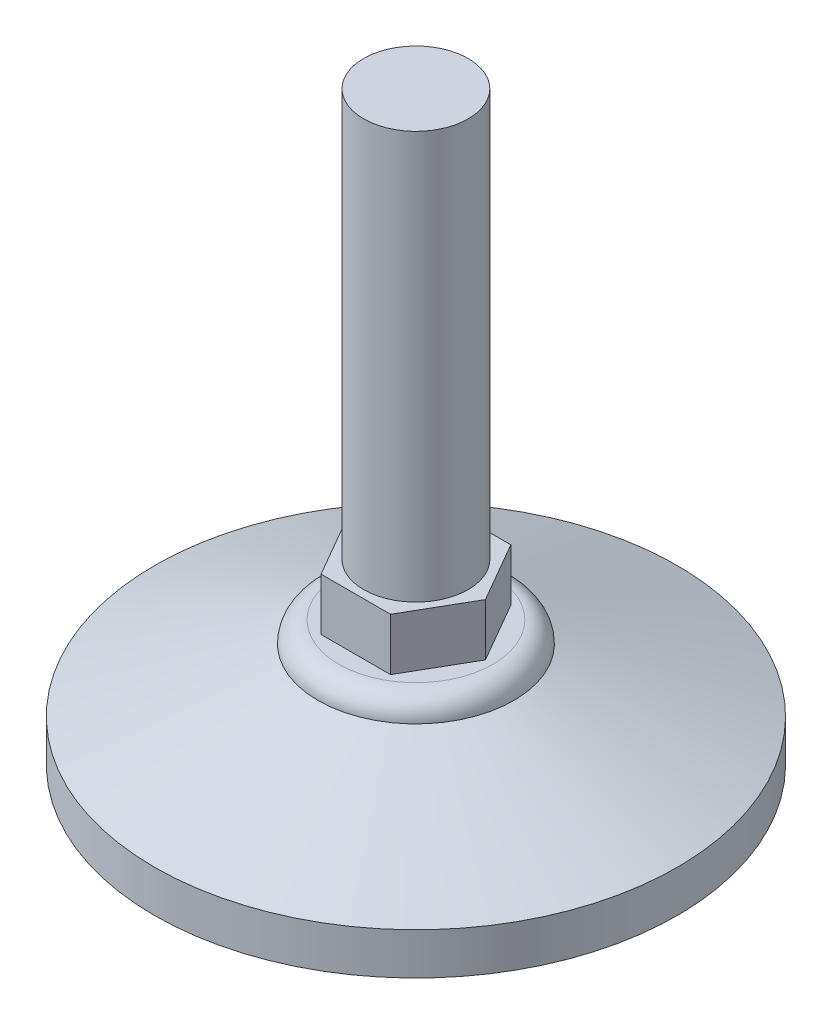
ISO-10303-21;
HEADER;
FILE_DESCRIPTION(('STEP AP214'),'2;1');
FILE_NAME('part.step','',(''),(''),'','','');
FILE_SCHEMA(('AUTOMOTIVE_DESIGN { 1 0 10303 214 1 1 1 1 }'));
ENDSEC;
DATA;
#1=APPLICATION_CONTEXT('core data for automotive mechanical design processes');
#2=APPLICATION_PROTOCOL_DEFINITION('international standard','automotive_design',2000,#1);
#3=PRODUCT_CONTEXT('',#1,'mechanical');
#4=PRODUCT('Part','Part','',(#3));
#5=PRODUCT_RELATED_PRODUCT_CATEGORY('part','',(#4));
#6=PRODUCT_DEFINITION_FORMATION('','',#4);
#7=PRODUCT_DEFINITION_CONTEXT('part definition',#1,'design');
#8=PRODUCT_DEFINITION('design','',#6,#7);
#9=PRODUCT_DEFINITION_SHAPE('','',#8);
#10=(LENGTH_UNIT() NAMED_UNIT(*) SI_UNIT(.MILLI.,.METRE.));
#11=(NAMED_UNIT(*) PLANE_ANGLE_UNIT() SI_UNIT($,.RADIAN.));
#12=(NAMED_UNIT(*) SI_UNIT($,.STERADIAN.) SOLID_ANGLE_UNIT());
#13=UNCERTAINTY_MEASURE_WITH_UNIT(LENGTH_MEASURE(1.E-05),#10,'distance_accuracy_value','');
#14=(GEOMETRIC_REPRESENTATION_CONTEXT(3) GLOBAL_UNCERTAINTY_ASSIGNED_CONTEXT((#13)) GLOBAL_UNIT_ASSIGNED_CONTEXT((#10,
#11,#12)) REPRESENTATION_CONTEXT('',''));
#15=CARTESIAN_POINT('',(0.,0.,0.));
#16=DIRECTION('',(0.,0.,1.));
#17=DIRECTION('',(1.,0.,0.));
#18=AXIS2_PLACEMENT_3D('',#15,#16,#17);
#19=CARTESIAN_POINT('',(0.,12.,0.));
#20=DIRECTION('',(0.,1.,0.));
#21=DIRECTION('',(0.,0.,1.));
#22=AXIS2_PLACEMENT_3D('',#19,#20,#21);
#23=PLANE('',#22);
#24=CARTESIAN_POINT('',(0.,12.,0.));
#25=DIRECTION('',(0.,1.,0.));
#26=DIRECTION('',(0.,0.,1.));
#27=AXIS2_PLACEMENT_3D('',#24,#25,#26);
#28=CIRCLE('',#27,7.36946561183714);
#29=CARTESIAN_POINT('',(0.,12.,7.36946561183714));
#30=VERTEX_POINT('',#29);
#31=EDGE_CURVE('E11',#30,#30,#28,.T.);
#32=ORIENTED_EDGE('',*,*,#31,.T.);
#33=EDGE_LOOP('',(#32));
#34=FACE_BOUND('',#33,.T.);
#35=DIRECTION('',(-0.500000000000001,0.,-0.866025403784438));
#36=VECTOR('',#35,1.);
#37=CARTESIAN_POINT('',(6.6450532714932,12.,0.));
#38=LINE('',#37,#36);
#39=CARTESIAN_POINT('',(6.6450532714932,12.,0.));
#40=VERTEX_POINT('',#39);
#41=CARTESIAN_POINT('',(3.32252663574659,12.,-5.75478494261401));
#42=VERTEX_POINT('',#41);
#43=EDGE_CURVE('E127',#40,#42,#38,.T.);
#44=ORIENTED_EDGE('',*,*,#43,.F.);
#45=DIRECTION('',(0.499999999999995,0.,-0.866025403784442));
#46=VECTOR('',#45,1.);
#47=CARTESIAN_POINT('',(3.32252663574667,12.,5.75478494261396));
#48=LINE('',#47,#46);
#49=CARTESIAN_POINT('',(3.32252663574667,12.,5.75478494261396));
#50=VERTEX_POINT('',#49);
#51=EDGE_CURVE('E124',#50,#40,#48,.T.);
#52=ORIENTED_EDGE('',*,*,#51,.F.);
#53=DIRECTION('',(1.,0.,0.));
#54=VECTOR('',#53,1.);
#55=CARTESIAN_POINT('',(-3.32252663574655,12.,5.75478494261403));
#56=LINE('',#55,#54);
#57=CARTESIAN_POINT('',(-3.32252663574655,12.,5.75478494261403));
#58=VERTEX_POINT('',#57);
#59=EDGE_CURVE('E83',#58,#50,#56,.T.);
#60=ORIENTED_EDGE('',*,*,#59,.F.);
#61=DIRECTION('',(0.500000000000007,0.,0.866025403784434));
#62=VECTOR('',#61,1.);
#63=CARTESIAN_POINT('',(-6.6450532714932,12.,0.));
#64=LINE('',#63,#62);
#65=CARTESIAN_POINT('',(-6.6450532714932,12.,0.));
#66=VERTEX_POINT('',#65);
#67=EDGE_CURVE('E132',#66,#58,#64,.T.);
#68=ORIENTED_EDGE('',*,*,#67,.F.);
#69=DIRECTION('',(-0.499999999999995,0.,0.866025403784441));
#70=VECTOR('',#69,1.);
#71=CARTESIAN_POINT('',(-3.32252663574663,12.,-5.75478494261399));
#72=LINE('',#71,#70);
#73=CARTESIAN_POINT('',(-3.32252663574663,12.,-5.75478494261399));
#74=VERTEX_POINT('',#73);
#75=EDGE_CURVE('E113',#74,#66,#72,.T.);
#76=ORIENTED_EDGE('',*,*,#75,.F.);
#77=DIRECTION('',(-1.,0.,0.));
#78=VECTOR('',#77,1.);
#79=CARTESIAN_POINT('',(3.32252663574659,12.,-5.75478494261401));
#80=LINE('',#79,#78);
#81=EDGE_CURVE('E129',#42,#74,#80,.T.);
#82=ORIENTED_EDGE('',*,*,#81,.F.);
#83=EDGE_LOOP('',(#44,#52,#60,#68,#76,#82));
#84=FACE_BOUND('',#83,.T.);
#85=ADVANCED_FACE('F39',(#34,#84),#23,.T.);
#86=CARTESIAN_POINT('',(0.,4.,0.));
#87=DIRECTION('',(0.,-1.,0.));
#88=DIRECTION('',(0.,0.,-1.));
#89=AXIS2_PLACEMENT_3D('',#86,#87,#88);
#90=CYLINDRICAL_SURFACE('',#89,25.);
#91=CARTESIAN_POINT('',(0.,4.,0.));
#92=DIRECTION('',(0.,1.,0.));
#93=DIRECTION('',(0.,0.,1.));
#94=AXIS2_PLACEMENT_3D('',#91,#92,#93);
#95=CIRCLE('',#94,25.);
#96=CARTESIAN_POINT('',(0.,4.,25.));
#97=VERTEX_POINT('',#96);
#98=EDGE_CURVE('E48',#97,#97,#95,.T.);
#99=ORIENTED_EDGE('',*,*,#98,.F.);
#100=EDGE_LOOP('',(#99));
#101=FACE_BOUND('',#100,.T.);
#102=CARTESIAN_POINT('',(0.,0.,0.));
#103=DIRECTION('',(0.,1.,0.));
#104=DIRECTION('',(0.,0.,1.));
#105=AXIS2_PLACEMENT_3D('',#102,#103,#104);
#106=CIRCLE('',#105,25.);
#107=CARTESIAN_POINT('',(0.,0.,25.));
#108=VERTEX_POINT('',#107);
#109=EDGE_CURVE('E150',#108,#108,#106,.T.);
#110=ORIENTED_EDGE('',*,*,#109,.T.);
#111=EDGE_LOOP('',(#110));
#112=FACE_BOUND('',#111,.T.);
#113=ADVANCED_FACE('F156',(#101,#112),#90,.T.);
#114=CARTESIAN_POINT('',(0.,0.,0.));
#115=DIRECTION('',(0.,1.,0.));
#116=DIRECTION('',(0.,0.,1.));
#117=AXIS2_PLACEMENT_3D('',#114,#115,#116);
#118=PLANE('',#117);
#119=ORIENTED_EDGE('',*,*,#109,.F.);
#120=EDGE_LOOP('',(#119));
#121=FACE_BOUND('',#120,.T.);
#122=ADVANCED_FACE('F158',(#121),#118,.F.);
#123=CARTESIAN_POINT('',(0.,4.,0.));
#124=DIRECTION('',(0.,-1.,0.));
#125=DIRECTION('',(0.,0.,1.));
#126=AXIS2_PLACEMENT_3D('',#123,#124,#125);
#127=CONICAL_SURFACE('',#126,25.,1.20427718387609);
#128=CARTESIAN_POINT('',(0.,10.,0.));
#129=DIRECTION('',(0.,1.,0.));
#130=DIRECTION('',(0.,0.,1.));
#131=AXIS2_PLACEMENT_3D('',#128,#129,#130);
#132=CIRCLE('',#131,9.36946561183714);
#133=CARTESIAN_POINT('',(0.,10.,9.36946561183714));
#134=VERTEX_POINT('',#133);
#135=EDGE_CURVE('E147',#134,#134,#132,.T.);
#136=ORIENTED_EDGE('',*,*,#135,.F.);
#137=EDGE_LOOP('',(#136));
#138=FACE_BOUND('',#137,.T.);
#139=ORIENTED_EDGE('',*,*,#98,.T.);
#140=EDGE_LOOP('',(#139));
#141=FACE_BOUND('',#140,.T.);
#142=ADVANCED_FACE('F160',(#138,#141),#127,.T.);
#143=CARTESIAN_POINT('',(0.,10.,0.));
#144=DIRECTION('',(0.,1.,0.));
#145=DIRECTION('',(0.,0.,1.));
#146=AXIS2_PLACEMENT_3D('',#143,#144,#145);
#147=TOROIDAL_SURFACE('',#146,7.36946561183714,2.);
#148=ORIENTED_EDGE('',*,*,#135,.T.);
#149=EDGE_LOOP('',(#148));
#150=FACE_BOUND('',#149,.T.);
#151=ORIENTED_EDGE('',*,*,#31,.F.);
#152=EDGE_LOOP('',(#151));
#153=FACE_BOUND('',#152,.T.);
#154=ADVANCED_FACE('F41',(#150,#153),#147,.T.);
#155=CARTESIAN_POINT('',(3.32252663574667,17.,5.75478494261396));
#156=DIRECTION('',(-0.866025403784441,0.,-0.499999999999995));
#157=DIRECTION('',(-0.499999999999995,0.,0.866025403784441));
#158=AXIS2_PLACEMENT_3D('',#155,#156,#157);
#159=PLANE('',#158);
#160=ORIENTED_EDGE('',*,*,#51,.T.);
#161=DIRECTION('',(0.,-1.,0.));
#162=VECTOR('',#161,1.);
#163=CARTESIAN_POINT('',(6.6450532714932,17.,0.));
#164=LINE('',#163,#162);
#165=CARTESIAN_POINT('',(6.6450532714932,17.,0.));
#166=VERTEX_POINT('',#165);
#167=EDGE_CURVE('E142',#166,#40,#164,.T.);
#168=ORIENTED_EDGE('',*,*,#167,.F.);
#169=DIRECTION('',(0.499999999999995,0.,-0.866025403784442));
#170=VECTOR('',#169,1.);
#171=CARTESIAN_POINT('',(3.32252663574667,17.,5.75478494261396));
#172=LINE('',#171,#170);
#173=CARTESIAN_POINT('',(3.32252663574667,17.,5.75478494261396));
#174=VERTEX_POINT('',#173);
#175=EDGE_CURVE('E135',#174,#166,#172,.T.);
#176=ORIENTED_EDGE('',*,*,#175,.F.);
#177=DIRECTION('',(0.,-1.,0.));
#178=VECTOR('',#177,1.);
#179=CARTESIAN_POINT('',(3.32252663574667,17.,5.75478494261396));
#180=LINE('',#179,#178);
#181=EDGE_CURVE('E120',#174,#50,#180,.T.);
#182=ORIENTED_EDGE('',*,*,#181,.T.);
#183=EDGE_LOOP('',(#160,#168,#176,#182));
#184=FACE_BOUND('',#183,.T.);
#185=ADVANCED_FACE('F186',(#184),#159,.F.);
#186=CARTESIAN_POINT('',(6.6450532714932,17.,0.));
#187=DIRECTION('',(-0.866025403784438,0.,0.500000000000001));
#188=DIRECTION('',(0.500000000000001,0.,0.866025403784438));
#189=AXIS2_PLACEMENT_3D('',#186,#187,#188);
#190=PLANE('',#189);
#191=ORIENTED_EDGE('',*,*,#43,.T.);
#192=DIRECTION('',(0.,-1.,0.));
#193=VECTOR('',#192,1.);
#194=CARTESIAN_POINT('',(3.32252663574659,17.,-5.75478494261401));
#195=LINE('',#194,#193);
#196=CARTESIAN_POINT('',(3.32252663574659,17.,-5.75478494261401));
#197=VERTEX_POINT('',#196);
#198=EDGE_CURVE('E139',#197,#42,#195,.T.);
#199=ORIENTED_EDGE('',*,*,#198,.F.);
#200=DIRECTION('',(-0.500000000000001,0.,-0.866025403784438));
#201=VECTOR('',#200,1.);
#202=CARTESIAN_POINT('',(6.6450532714932,17.,0.));
#203=LINE('',#202,#201);
#204=EDGE_CURVE('E91',#166,#197,#203,.T.);
#205=ORIENTED_EDGE('',*,*,#204,.F.);
#206=ORIENTED_EDGE('',*,*,#167,.T.);
#207=EDGE_LOOP('',(#191,#199,#205,#206));
#208=FACE_BOUND('',#207,.T.);
#209=ADVANCED_FACE('F189',(#208),#190,.F.);
#210=CARTESIAN_POINT('',(3.32252663574659,17.,-5.75478494261401));
#211=DIRECTION('',(0.,0.,1.));
#212=DIRECTION('',(1.,0.,0.));
#213=AXIS2_PLACEMENT_3D('',#210,#211,#212);
#214=PLANE('',#213);
#215=ORIENTED_EDGE('',*,*,#81,.T.);
#216=DIRECTION('',(0.,-1.,0.));
#217=VECTOR('',#216,1.);
#218=CARTESIAN_POINT('',(-3.32252663574663,17.,-5.75478494261399));
#219=LINE('',#218,#217);
#220=CARTESIAN_POINT('',(-3.32252663574663,17.,-5.75478494261399));
#221=VERTEX_POINT('',#220);
#222=EDGE_CURVE('E116',#221,#74,#219,.T.);
#223=ORIENTED_EDGE('',*,*,#222,.F.);
#224=DIRECTION('',(-1.,0.,0.));
#225=VECTOR('',#224,1.);
#226=CARTESIAN_POINT('',(3.32252663574659,17.,-5.75478494261401));
#227=LINE('',#226,#225);
#228=EDGE_CURVE('E104',#197,#221,#227,.T.);
#229=ORIENTED_EDGE('',*,*,#228,.F.);
#230=ORIENTED_EDGE('',*,*,#198,.T.);
#231=EDGE_LOOP('',(#215,#223,#229,#230));
#232=FACE_BOUND('',#231,.T.);
#233=ADVANCED_FACE('F193',(#232),#214,.F.);
#234=CARTESIAN_POINT('',(-3.32252663574663,17.,-5.75478494261399));
#235=DIRECTION('',(0.866025403784442,0.,0.499999999999995));
#236=DIRECTION('',(0.499999999999995,0.,-0.866025403784442));
#237=AXIS2_PLACEMENT_3D('',#234,#235,#236);
#238=PLANE('',#237);
#239=ORIENTED_EDGE('',*,*,#75,.T.);
#240=DIRECTION('',(0.,-1.,0.));
#241=VECTOR('',#240,1.);
#242=CARTESIAN_POINT('',(-6.6450532714932,17.,0.));
#243=LINE('',#242,#241);
#244=CARTESIAN_POINT('',(-6.6450532714932,17.,0.));
#245=VERTEX_POINT('',#244);
#246=EDGE_CURVE('E110',#245,#66,#243,.T.);
#247=ORIENTED_EDGE('',*,*,#246,.F.);
#248=DIRECTION('',(-0.499999999999995,0.,0.866025403784441));
#249=VECTOR('',#248,1.);
#250=CARTESIAN_POINT('',(-3.32252663574663,17.,-5.75478494261399));
#251=LINE('',#250,#249);
#252=EDGE_CURVE('E98',#221,#245,#251,.T.);
#253=ORIENTED_EDGE('',*,*,#252,.F.);
#254=ORIENTED_EDGE('',*,*,#222,.T.);
#255=EDGE_LOOP('',(#239,#247,#253,#254));
#256=FACE_BOUND('',#255,.T.);
#257=ADVANCED_FACE('F111',(#256),#238,.F.);
#258=CARTESIAN_POINT('',(-6.6450532714932,17.,0.));
#259=DIRECTION('',(0.866025403784435,0.,-0.500000000000007));
#260=DIRECTION('',(-0.500000000000007,0.,-0.866025403784435));
#261=AXIS2_PLACEMENT_3D('',#258,#259,#260);
#262=PLANE('',#261);
#263=ORIENTED_EDGE('',*,*,#67,.T.);
#264=DIRECTION('',(0.,-1.,0.));
#265=VECTOR('',#264,1.);
#266=CARTESIAN_POINT('',(-3.32252663574655,17.,5.75478494261403));
#267=LINE('',#266,#265);
#268=CARTESIAN_POINT('',(-3.32252663574655,17.,5.75478494261403));
#269=VERTEX_POINT('',#268);
#270=EDGE_CURVE('E55',#269,#58,#267,.T.);
#271=ORIENTED_EDGE('',*,*,#270,.F.);
#272=DIRECTION('',(0.500000000000007,0.,0.866025403784434));
#273=VECTOR('',#272,1.);
#274=CARTESIAN_POINT('',(-6.6450532714932,17.,0.));
#275=LINE('',#274,#273);
#276=EDGE_CURVE('E102',#245,#269,#275,.T.);
#277=ORIENTED_EDGE('',*,*,#276,.F.);
#278=ORIENTED_EDGE('',*,*,#246,.T.);
#279=EDGE_LOOP('',(#263,#271,#277,#278));
#280=FACE_BOUND('',#279,.T.);
#281=ADVANCED_FACE('F118',(#280),#262,.F.);
#282=CARTESIAN_POINT('',(-3.32252663574655,17.,5.75478494261403));
#283=DIRECTION('',(0.,0.,-1.));
#284=DIRECTION('',(-1.,0.,0.));
#285=AXIS2_PLACEMENT_3D('',#282,#283,#284);
#286=PLANE('',#285);
#287=ORIENTED_EDGE('',*,*,#59,.T.);
#288=ORIENTED_EDGE('',*,*,#181,.F.);
#289=DIRECTION('',(1.,0.,0.));
#290=VECTOR('',#289,1.);
#291=CARTESIAN_POINT('',(-3.32252663574655,17.,5.75478494261403));
#292=LINE('',#291,#290);
#293=EDGE_CURVE('E63',#269,#174,#292,.T.);
#294=ORIENTED_EDGE('',*,*,#293,.F.);
#295=ORIENTED_EDGE('',*,*,#270,.T.);
#296=EDGE_LOOP('',(#287,#288,#294,#295));
#297=FACE_BOUND('',#296,.T.);
#298=ADVANCED_FACE('F201',(#297),#286,.F.);
#299=CARTESIAN_POINT('',(0.,17.,0.));
#300=DIRECTION('',(0.,1.,0.));
#301=DIRECTION('',(0.,0.,1.));
#302=AXIS2_PLACEMENT_3D('',#299,#300,#301);
#303=PLANE('',#302);
#304=CARTESIAN_POINT('',(0.,17.,0.));
#305=DIRECTION('',(0.,1.,0.));
#306=DIRECTION('',(0.,0.,1.));
#307=AXIS2_PLACEMENT_3D('',#304,#305,#306);
#308=CIRCLE('',#307,5.);
#309=CARTESIAN_POINT('',(0.,17.,5.));
#310=VERTEX_POINT('',#309);
#311=EDGE_CURVE('E43',#310,#310,#308,.T.);
#312=ORIENTED_EDGE('',*,*,#311,.F.);
#313=EDGE_LOOP('',(#312));
#314=FACE_BOUND('',#313,.T.);
#315=ORIENTED_EDGE('',*,*,#175,.T.);
#316=ORIENTED_EDGE('',*,*,#204,.T.);
#317=ORIENTED_EDGE('',*,*,#228,.T.);
#318=ORIENTED_EDGE('',*,*,#252,.T.);
#319=ORIENTED_EDGE('',*,*,#276,.T.);
#320=ORIENTED_EDGE('',*,*,#293,.T.);
#321=EDGE_LOOP('',(#315,#316,#317,#318,#319,#320));
#322=FACE_BOUND('',#321,.T.);
#323=ADVANCED_FACE('F100',(#314,#322),#303,.T.);
#324=CARTESIAN_POINT('',(0.,56.,0.));
#325=DIRECTION('',(0.,1.,0.));
#326=DIRECTION('',(0.,0.,1.));
#327=AXIS2_PLACEMENT_3D('',#324,#325,#326);
#328=PLANE('',#327);
#329=CARTESIAN_POINT('',(0.,56.,0.));
#330=DIRECTION('',(0.,1.,0.));
#331=DIRECTION('',(0.,0.,1.));
#332=AXIS2_PLACEMENT_3D('',#329,#330,#331);
#333=CIRCLE('',#332,5.);
#334=CARTESIAN_POINT('',(0.,56.,5.));
#335=VERTEX_POINT('',#334);
#336=EDGE_CURVE('E144',#335,#335,#333,.T.);
#337=ORIENTED_EDGE('',*,*,#336,.T.);
#338=EDGE_LOOP('',(#337));
#339=FACE_BOUND('',#338,.T.);
#340=ADVANCED_FACE('F181',(#339),#328,.T.);
#341=CARTESIAN_POINT('',(0.,56.,0.));
#342=DIRECTION('',(0.,-1.,0.));
#343=DIRECTION('',(0.,0.,-1.));
#344=AXIS2_PLACEMENT_3D('',#341,#342,#343);
#345=CYLINDRICAL_SURFACE('',#344,5.);
#346=ORIENTED_EDGE('',*,*,#311,.T.);
#347=EDGE_LOOP('',(#346));
#348=FACE_BOUND('',#347,.T.);
#349=ORIENTED_EDGE('',*,*,#336,.F.);
#350=EDGE_LOOP('',(#349));
#351=FACE_BOUND('',#350,.T.);
#352=ADVANCED_FACE('F178',(#348,#351),#345,.T.);
#353=CLOSED_SHELL('',(#85,#113,#122,#142,#154,#185,#209,#233,#257,#281,#298,#323,#340,#352));
#354=MANIFOLD_SOLID_BREP('B2',#353);
#355=ADVANCED_BREP_SHAPE_REPRESENTATION('',(#18,#354),#14);
#356=SHAPE_DEFINITION_REPRESENTATION(#9,#355);
ENDSEC;
END-ISO-10303-21;
